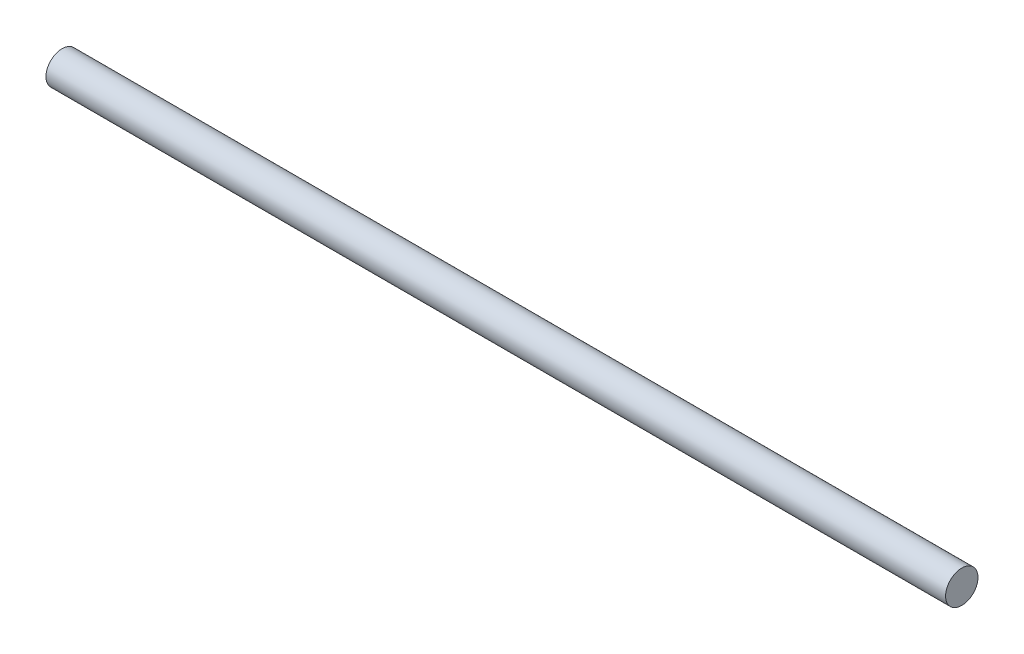
ISO-10303-21;
HEADER;
FILE_DESCRIPTION(('STEP AP214'),'2;1');
FILE_NAME('part.step','',(''),(''),'','','');
FILE_SCHEMA(('AUTOMOTIVE_DESIGN { 1 0 10303 214 1 1 1 1 }'));
ENDSEC;
DATA;
#1=APPLICATION_CONTEXT('core data for automotive mechanical design processes');
#2=APPLICATION_PROTOCOL_DEFINITION('international standard','automotive_design',2000,#1);
#3=PRODUCT_CONTEXT('',#1,'mechanical');
#4=PRODUCT('Part','Part','',(#3));
#5=PRODUCT_RELATED_PRODUCT_CATEGORY('part','',(#4));
#6=PRODUCT_DEFINITION_FORMATION('','',#4);
#7=PRODUCT_DEFINITION_CONTEXT('part definition',#1,'design');
#8=PRODUCT_DEFINITION('design','',#6,#7);
#9=PRODUCT_DEFINITION_SHAPE('','',#8);
#10=(LENGTH_UNIT() NAMED_UNIT(*) SI_UNIT(.MILLI.,.METRE.));
#11=(NAMED_UNIT(*) PLANE_ANGLE_UNIT() SI_UNIT($,.RADIAN.));
#12=(NAMED_UNIT(*) SI_UNIT($,.STERADIAN.) SOLID_ANGLE_UNIT());
#13=UNCERTAINTY_MEASURE_WITH_UNIT(LENGTH_MEASURE(1.E-05),#10,'distance_accuracy_value','');
#14=(GEOMETRIC_REPRESENTATION_CONTEXT(3) GLOBAL_UNCERTAINTY_ASSIGNED_CONTEXT((#13)) GLOBAL_UNIT_ASSIGNED_CONTEXT((#10,
#11,#12)) REPRESENTATION_CONTEXT('',''));
#15=CARTESIAN_POINT('',(0.,0.,0.));
#16=DIRECTION('',(0.,0.,1.));
#17=DIRECTION('',(1.,0.,0.));
#18=AXIS2_PLACEMENT_3D('',#15,#16,#17);
#19=CARTESIAN_POINT('',(222.,0.,0.));
#20=DIRECTION('',(-1.,0.,0.));
#21=DIRECTION('',(0.,0.,1.));
#22=AXIS2_PLACEMENT_3D('',#19,#20,#21);
#23=PLANE('',#22);
#24=CARTESIAN_POINT('',(222.,0.,0.));
#25=DIRECTION('',(1.,0.,0.));
#26=DIRECTION('',(0.,0.,-1.));
#27=AXIS2_PLACEMENT_3D('',#24,#25,#26);
#28=CIRCLE('',#27,8.);
#29=CARTESIAN_POINT('',(222.,0.,-8.00000000000004));
#30=VERTEX_POINT('',#29);
#31=EDGE_CURVE('E10',#30,#30,#28,.T.);
#32=ORIENTED_EDGE('',*,*,#31,.T.);
#33=EDGE_LOOP('',(#32));
#34=FACE_BOUND('',#33,.T.);
#35=ADVANCED_FACE('F43',(#34),#23,.F.);
#36=CARTESIAN_POINT('',(222.,0.,0.));
#37=DIRECTION('',(1.,0.,0.));
#38=DIRECTION('',(0.,0.,-1.));
#39=AXIS2_PLACEMENT_3D('',#36,#37,#38);
#40=CYLINDRICAL_SURFACE('',#39,8.);
#41=ORIENTED_EDGE('',*,*,#31,.F.);
#42=EDGE_LOOP('',(#41));
#43=FACE_BOUND('',#42,.T.);
#44=CARTESIAN_POINT('',(-222.,0.,0.));
#45=DIRECTION('',(1.,0.,0.));
#46=DIRECTION('',(0.,0.,-1.));
#47=AXIS2_PLACEMENT_3D('',#44,#45,#46);
#48=CIRCLE('',#47,8.);
#49=CARTESIAN_POINT('',(-222.,0.,-8.00000000000004));
#50=VERTEX_POINT('',#49);
#51=EDGE_CURVE('E50',#50,#50,#48,.T.);
#52=ORIENTED_EDGE('',*,*,#51,.T.);
#53=EDGE_LOOP('',(#52));
#54=FACE_BOUND('',#53,.T.);
#55=ADVANCED_FACE('F57',(#43,#54),#40,.T.);
#56=CARTESIAN_POINT('',(-222.,0.,0.));
#57=DIRECTION('',(1.,0.,0.));
#58=DIRECTION('',(0.,0.,-1.));
#59=AXIS2_PLACEMENT_3D('',#56,#57,#58);
#60=PLANE('',#59);
#61=ORIENTED_EDGE('',*,*,#51,.F.);
#62=EDGE_LOOP('',(#61));
#63=FACE_BOUND('',#62,.T.);
#64=ADVANCED_FACE('F59',(#63),#60,.F.);
#65=CLOSED_SHELL('',(#35,#55,#64));
#66=MANIFOLD_SOLID_BREP('B2',#65);
#67=ADVANCED_BREP_SHAPE_REPRESENTATION('',(#18,#66),#14);
#68=SHAPE_DEFINITION_REPRESENTATION(#9,#67);
ENDSEC;
END-ISO-10303-21;
